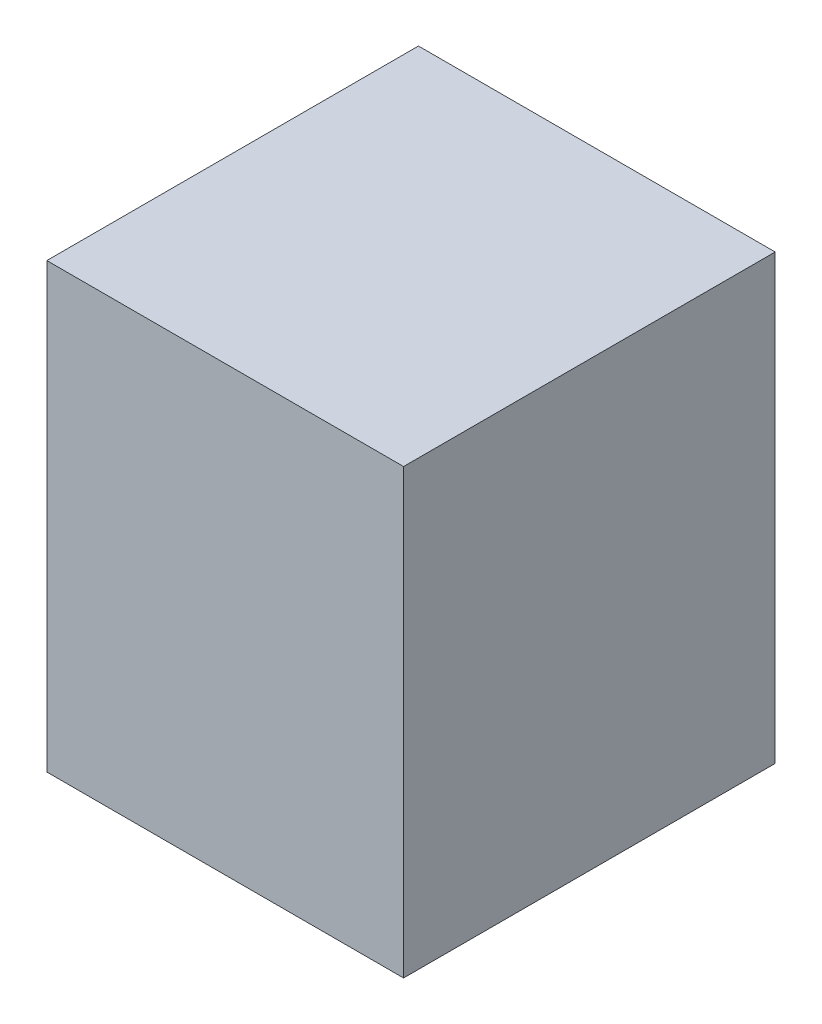
ISO-10303-21;
HEADER;
FILE_DESCRIPTION(('STEP AP214'),'2;1');
FILE_NAME('part.step','',(''),(''),'','','');
FILE_SCHEMA(('AUTOMOTIVE_DESIGN { 1 0 10303 214 1 1 1 1 }'));
ENDSEC;
DATA;
#1=APPLICATION_CONTEXT('core data for automotive mechanical design processes');
#2=APPLICATION_PROTOCOL_DEFINITION('international standard','automotive_design',2000,#1);
#3=PRODUCT_CONTEXT('',#1,'mechanical');
#4=PRODUCT('Part','Part','',(#3));
#5=PRODUCT_RELATED_PRODUCT_CATEGORY('part','',(#4));
#6=PRODUCT_DEFINITION_FORMATION('','',#4);
#7=PRODUCT_DEFINITION_CONTEXT('part definition',#1,'design');
#8=PRODUCT_DEFINITION('design','',#6,#7);
#9=PRODUCT_DEFINITION_SHAPE('','',#8);
#10=(LENGTH_UNIT() NAMED_UNIT(*) SI_UNIT(.MILLI.,.METRE.));
#11=(NAMED_UNIT(*) PLANE_ANGLE_UNIT() SI_UNIT($,.RADIAN.));
#12=(NAMED_UNIT(*) SI_UNIT($,.STERADIAN.) SOLID_ANGLE_UNIT());
#13=UNCERTAINTY_MEASURE_WITH_UNIT(LENGTH_MEASURE(1.E-05),#10,'distance_accuracy_value','');
#14=(GEOMETRIC_REPRESENTATION_CONTEXT(3) GLOBAL_UNCERTAINTY_ASSIGNED_CONTEXT((#13)) GLOBAL_UNIT_ASSIGNED_CONTEXT((#10,
#11,#12)) REPRESENTATION_CONTEXT('',''));
#15=CARTESIAN_POINT('',(0.,0.,0.));
#16=DIRECTION('',(0.,0.,1.));
#17=DIRECTION('',(1.,0.,0.));
#18=AXIS2_PLACEMENT_3D('',#15,#16,#17);
#19=CARTESIAN_POINT('',(-1.20000014,1.48999956,0.));
#20=DIRECTION('',(1.,0.,0.));
#21=DIRECTION('',(0.,0.,-1.));
#22=AXIS2_PLACEMENT_3D('',#19,#20,#21);
#23=PLANE('',#22);
#24=DIRECTION('',(0.,0.,1.));
#25=VECTOR('',#24,1.);
#26=CARTESIAN_POINT('',(-1.20000014,-1.48999956,0.));
#27=LINE('',#26,#25);
#28=CARTESIAN_POINT('',(-1.20000014,-1.48999956,0.));
#29=VERTEX_POINT('',#28);
#30=CARTESIAN_POINT('',(-1.20000014,-1.48999956,2.50000008));
#31=VERTEX_POINT('',#30);
#32=EDGE_CURVE('E19',#29,#31,#27,.T.);
#33=ORIENTED_EDGE('',*,*,#32,.T.);
#34=DIRECTION('',(0.,1.,0.));
#35=VECTOR('',#34,1.);
#36=CARTESIAN_POINT('',(-1.20000014,-1.48999956,2.50000008));
#37=LINE('',#36,#35);
#38=CARTESIAN_POINT('',(-1.20000014,1.48999956,2.50000008));
#39=VERTEX_POINT('',#38);
#40=EDGE_CURVE('E54',#31,#39,#37,.T.);
#41=ORIENTED_EDGE('',*,*,#40,.T.);
#42=DIRECTION('',(0.,0.,-1.));
#43=VECTOR('',#42,1.);
#44=CARTESIAN_POINT('',(-1.20000014,1.48999956,0.));
#45=LINE('',#44,#43);
#46=CARTESIAN_POINT('',(-1.20000014,1.48999956,0.));
#47=VERTEX_POINT('',#46);
#48=EDGE_CURVE('E73',#39,#47,#45,.T.);
#49=ORIENTED_EDGE('',*,*,#48,.T.);
#50=DIRECTION('',(0.,1.,0.));
#51=VECTOR('',#50,1.);
#52=CARTESIAN_POINT('',(-1.20000014,-1.48999956,0.));
#53=LINE('',#52,#51);
#54=EDGE_CURVE('E65',#29,#47,#53,.T.);
#55=ORIENTED_EDGE('',*,*,#54,.F.);
#56=EDGE_LOOP('',(#33,#41,#49,#55));
#57=FACE_BOUND('',#56,.T.);
#58=ADVANCED_FACE('F16',(#57),#23,.F.);
#59=CARTESIAN_POINT('',(-1.20000014,-1.48999956,0.));
#60=DIRECTION('',(0.,1.,0.));
#61=DIRECTION('',(0.,0.,1.));
#62=AXIS2_PLACEMENT_3D('',#59,#60,#61);
#63=PLANE('',#62);
#64=DIRECTION('',(0.,0.,1.));
#65=VECTOR('',#64,1.);
#66=CARTESIAN_POINT('',(1.20000014,-1.48999956,0.));
#67=LINE('',#66,#65);
#68=CARTESIAN_POINT('',(1.20000014,-1.48999956,0.));
#69=VERTEX_POINT('',#68);
#70=CARTESIAN_POINT('',(1.20000014,-1.48999956,2.50000008));
#71=VERTEX_POINT('',#70);
#72=EDGE_CURVE('E71',#69,#71,#67,.T.);
#73=ORIENTED_EDGE('',*,*,#72,.T.);
#74=DIRECTION('',(-1.,0.,0.));
#75=VECTOR('',#74,1.);
#76=CARTESIAN_POINT('',(-1.20000014,-1.48999956,2.50000008));
#77=LINE('',#76,#75);
#78=EDGE_CURVE('E61',#71,#31,#77,.T.);
#79=ORIENTED_EDGE('',*,*,#78,.T.);
#80=ORIENTED_EDGE('',*,*,#32,.F.);
#81=DIRECTION('',(-1.,0.,0.));
#82=VECTOR('',#81,1.);
#83=CARTESIAN_POINT('',(-1.20000014,-1.48999956,0.));
#84=LINE('',#83,#82);
#85=EDGE_CURVE('E79',#69,#29,#84,.T.);
#86=ORIENTED_EDGE('',*,*,#85,.F.);
#87=EDGE_LOOP('',(#73,#79,#80,#86));
#88=FACE_BOUND('',#87,.T.);
#89=ADVANCED_FACE('F70',(#88),#63,.F.);
#90=CARTESIAN_POINT('',(-1.20000014,-1.48999956,2.50000008));
#91=DIRECTION('',(0.,0.,-1.));
#92=DIRECTION('',(-1.,0.,0.));
#93=AXIS2_PLACEMENT_3D('',#90,#91,#92);
#94=PLANE('',#93);
#95=DIRECTION('',(0.,1.,0.));
#96=VECTOR('',#95,1.);
#97=CARTESIAN_POINT('',(1.20000014,-1.48999956,2.50000008));
#98=LINE('',#97,#96);
#99=CARTESIAN_POINT('',(1.20000014,1.48999956,2.50000008));
#100=VERTEX_POINT('',#99);
#101=EDGE_CURVE('E82',#71,#100,#98,.T.);
#102=ORIENTED_EDGE('',*,*,#101,.T.);
#103=DIRECTION('',(1.,0.,0.));
#104=VECTOR('',#103,1.);
#105=CARTESIAN_POINT('',(1.20000014,1.48999956,2.50000008));
#106=LINE('',#105,#104);
#107=EDGE_CURVE('E63',#100,#39,#106,.F.);
#108=ORIENTED_EDGE('',*,*,#107,.T.);
#109=ORIENTED_EDGE('',*,*,#40,.F.);
#110=ORIENTED_EDGE('',*,*,#78,.F.);
#111=EDGE_LOOP('',(#102,#108,#109,#110));
#112=FACE_BOUND('',#111,.T.);
#113=ADVANCED_FACE('F59',(#112),#94,.F.);
#114=CARTESIAN_POINT('',(1.20000014,1.48999956,0.));
#115=DIRECTION('',(0.,-1.,0.));
#116=DIRECTION('',(0.,0.,-1.));
#117=AXIS2_PLACEMENT_3D('',#114,#115,#116);
#118=PLANE('',#117);
#119=ORIENTED_EDGE('',*,*,#48,.F.);
#120=ORIENTED_EDGE('',*,*,#107,.F.);
#121=DIRECTION('',(0.,0.,1.));
#122=VECTOR('',#121,1.);
#123=CARTESIAN_POINT('',(1.20000014,1.48999956,0.));
#124=LINE('',#123,#122);
#125=CARTESIAN_POINT('',(1.20000014,1.48999956,0.));
#126=VERTEX_POINT('',#125);
#127=EDGE_CURVE('E25',#100,#126,#124,.F.);
#128=ORIENTED_EDGE('',*,*,#127,.T.);
#129=DIRECTION('',(-1.,0.,0.));
#130=VECTOR('',#129,1.);
#131=CARTESIAN_POINT('',(-1.20000014,1.48999956,0.));
#132=LINE('',#131,#130);
#133=EDGE_CURVE('E33',#47,#126,#132,.F.);
#134=ORIENTED_EDGE('',*,*,#133,.F.);
#135=EDGE_LOOP('',(#119,#120,#128,#134));
#136=FACE_BOUND('',#135,.T.);
#137=ADVANCED_FACE('F87',(#136),#118,.F.);
#138=CARTESIAN_POINT('',(-1.20000014,-1.48999956,0.));
#139=DIRECTION('',(0.,0.,-1.));
#140=DIRECTION('',(-1.,0.,0.));
#141=AXIS2_PLACEMENT_3D('',#138,#139,#140);
#142=PLANE('',#141);
#143=DIRECTION('',(0.,1.,0.));
#144=VECTOR('',#143,1.);
#145=CARTESIAN_POINT('',(1.20000014,-1.48999956,0.));
#146=LINE('',#145,#144);
#147=EDGE_CURVE('E10',#126,#69,#146,.F.);
#148=ORIENTED_EDGE('',*,*,#147,.T.);
#149=ORIENTED_EDGE('',*,*,#85,.T.);
#150=ORIENTED_EDGE('',*,*,#54,.T.);
#151=ORIENTED_EDGE('',*,*,#133,.T.);
#152=EDGE_LOOP('',(#148,#149,#150,#151));
#153=FACE_BOUND('',#152,.T.);
#154=ADVANCED_FACE('F90',(#153),#142,.T.);
#155=CARTESIAN_POINT('',(1.20000014,-1.48999956,0.));
#156=DIRECTION('',(-1.,0.,0.));
#157=DIRECTION('',(0.,0.,1.));
#158=AXIS2_PLACEMENT_3D('',#155,#156,#157);
#159=PLANE('',#158);
#160=ORIENTED_EDGE('',*,*,#127,.F.);
#161=ORIENTED_EDGE('',*,*,#101,.F.);
#162=ORIENTED_EDGE('',*,*,#72,.F.);
#163=ORIENTED_EDGE('',*,*,#147,.F.);
#164=EDGE_LOOP('',(#160,#161,#162,#163));
#165=FACE_BOUND('',#164,.T.);
#166=ADVANCED_FACE('F89',(#165),#159,.F.);
#167=CLOSED_SHELL('',(#58,#89,#113,#137,#154,#166));
#168=MANIFOLD_SOLID_BREP('B1',#167);
#169=ADVANCED_BREP_SHAPE_REPRESENTATION('',(#18,#168),#14);
#170=SHAPE_DEFINITION_REPRESENTATION(#9,#169);
ENDSEC;
END-ISO-10303-21;
